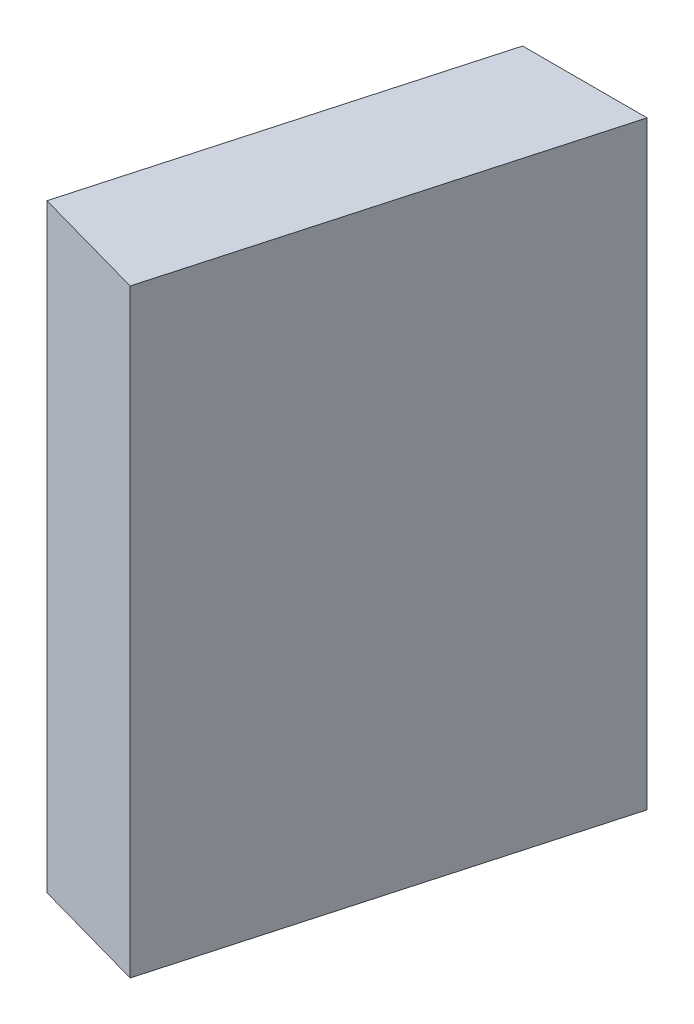
ISO-10303-21;
HEADER;
FILE_DESCRIPTION(('STEP AP214'),'2;1');
FILE_NAME('part.step','',(''),(''),'','','');
FILE_SCHEMA(('AUTOMOTIVE_DESIGN { 1 0 10303 214 1 1 1 1 }'));
ENDSEC;
DATA;
#1=APPLICATION_CONTEXT('core data for automotive mechanical design processes');
#2=APPLICATION_PROTOCOL_DEFINITION('international standard','automotive_design',2000,#1);
#3=PRODUCT_CONTEXT('',#1,'mechanical');
#4=PRODUCT('Part','Part','',(#3));
#5=PRODUCT_RELATED_PRODUCT_CATEGORY('part','',(#4));
#6=PRODUCT_DEFINITION_FORMATION('','',#4);
#7=PRODUCT_DEFINITION_CONTEXT('part definition',#1,'design');
#8=PRODUCT_DEFINITION('design','',#6,#7);
#9=PRODUCT_DEFINITION_SHAPE('','',#8);
#10=(LENGTH_UNIT() NAMED_UNIT(*) SI_UNIT(.MILLI.,.METRE.));
#11=(NAMED_UNIT(*) PLANE_ANGLE_UNIT() SI_UNIT($,.RADIAN.));
#12=(NAMED_UNIT(*) SI_UNIT($,.STERADIAN.) SOLID_ANGLE_UNIT());
#13=UNCERTAINTY_MEASURE_WITH_UNIT(LENGTH_MEASURE(1.E-05),#10,'distance_accuracy_value','');
#14=(GEOMETRIC_REPRESENTATION_CONTEXT(3) GLOBAL_UNCERTAINTY_ASSIGNED_CONTEXT((#13)) GLOBAL_UNIT_ASSIGNED_CONTEXT((#10,
#11,#12)) REPRESENTATION_CONTEXT('',''));
#15=CARTESIAN_POINT('',(0.,0.,0.));
#16=DIRECTION('',(0.,0.,1.));
#17=DIRECTION('',(1.,0.,0.));
#18=AXIS2_PLACEMENT_3D('',#15,#16,#17);
#19=CARTESIAN_POINT('',(-0.380918001429,2.27,0.620404284469));
#20=DIRECTION('',(0.963144527196361,0.,0.268984422842101));
#21=DIRECTION('',(0.268984422842101,0.,-0.963144527196361));
#22=AXIS2_PLACEMENT_3D('',#19,#20,#21);
#23=PLANE('',#22);
#24=DIRECTION('',(0.,1.,0.));
#25=VECTOR('',#24,1.);
#26=CARTESIAN_POINT('',(-0.380918001428911,2.27,0.620404284468681));
#27=LINE('',#26,#25);
#28=CARTESIAN_POINT('',(-0.380918001428956,1.27,0.62040428446884));
#29=VERTEX_POINT('',#28);
#30=CARTESIAN_POINT('',(-0.380918001428956,2.27,0.62040428446884));
#31=VERTEX_POINT('',#30);
#32=EDGE_CURVE('E19',#29,#31,#27,.T.);
#33=ORIENTED_EDGE('',*,*,#32,.T.);
#34=DIRECTION('',(0.268984422841911,0.,-0.963144527196414));
#35=VECTOR('',#34,1.);
#36=CARTESIAN_POINT('',(-0.380918001429,2.27,0.620404284469));
#37=LINE('',#36,#35);
#38=CARTESIAN_POINT('',(-0.207653155214969,2.27,0.));
#39=VERTEX_POINT('',#38);
#40=EDGE_CURVE('E54',#31,#39,#37,.T.);
#41=ORIENTED_EDGE('',*,*,#40,.T.);
#42=DIRECTION('',(0.,1.,0.));
#43=VECTOR('',#42,1.);
#44=CARTESIAN_POINT('',(-0.207653155215,2.27,0.));
#45=LINE('',#44,#43);
#46=CARTESIAN_POINT('',(-0.207653155214969,1.27,0.));
#47=VERTEX_POINT('',#46);
#48=EDGE_CURVE('E75',#39,#47,#45,.F.);
#49=ORIENTED_EDGE('',*,*,#48,.T.);
#50=DIRECTION('',(0.268984422841911,0.,-0.963144527196414));
#51=VECTOR('',#50,1.);
#52=CARTESIAN_POINT('',(-0.380918001429,1.27,0.620404284469));
#53=LINE('',#52,#51);
#54=EDGE_CURVE('E57',#29,#47,#53,.T.);
#55=ORIENTED_EDGE('',*,*,#54,.F.);
#56=EDGE_LOOP('',(#33,#41,#49,#55));
#57=FACE_BOUND('',#56,.T.);
#58=ADVANCED_FACE('F16',(#57),#23,.F.);
#59=CARTESIAN_POINT('',(-0.18828909599,2.27,0.674201169037));
#60=DIRECTION('',(0.268984422842101,0.,-0.963144527196361));
#61=DIRECTION('',(-0.963144527196361,0.,-0.268984422842101));
#62=AXIS2_PLACEMENT_3D('',#59,#60,#61);
#63=PLANE('',#62);
#64=DIRECTION('',(0.,1.,0.));
#65=VECTOR('',#64,1.);
#66=CARTESIAN_POINT('',(-0.188289095989392,2.27,0.67420116903717));
#67=LINE('',#66,#65);
#68=CARTESIAN_POINT('',(-0.188289095989848,1.27,0.674201169037043));
#69=VERTEX_POINT('',#68);
#70=CARTESIAN_POINT('',(-0.188289095989848,2.27,0.674201169037043));
#71=VERTEX_POINT('',#70);
#72=EDGE_CURVE('E72',#69,#71,#67,.T.);
#73=ORIENTED_EDGE('',*,*,#72,.T.);
#74=DIRECTION('',(-0.963144527196807,0.,-0.268984422840505));
#75=VECTOR('',#74,1.);
#76=CARTESIAN_POINT('',(-0.18828909599,2.27,0.674201169037));
#77=LINE('',#76,#75);
#78=EDGE_CURVE('E62',#71,#31,#77,.T.);
#79=ORIENTED_EDGE('',*,*,#78,.T.);
#80=ORIENTED_EDGE('',*,*,#32,.F.);
#81=DIRECTION('',(-0.963144527196807,0.,-0.268984422840505));
#82=VECTOR('',#81,1.);
#83=CARTESIAN_POINT('',(-0.18828909599,1.27,0.674201169037));
#84=LINE('',#83,#82);
#85=EDGE_CURVE('E78',#69,#29,#84,.T.);
#86=ORIENTED_EDGE('',*,*,#85,.F.);
#87=EDGE_LOOP('',(#73,#79,#80,#86));
#88=FACE_BOUND('',#87,.T.);
#89=ADVANCED_FACE('F71',(#88),#63,.F.);
#90=CARTESIAN_POINT('',(0.,2.27,0.));
#91=DIRECTION('',(0.,-1.,0.));
#92=DIRECTION('',(0.,0.,-1.));
#93=AXIS2_PLACEMENT_3D('',#90,#91,#92);
#94=PLANE('',#93);
#95=ORIENTED_EDGE('',*,*,#40,.F.);
#96=ORIENTED_EDGE('',*,*,#78,.F.);
#97=DIRECTION('',(-0.268984422842101,0.,0.963144527196361));
#98=VECTOR('',#97,1.);
#99=CARTESIAN_POINT('',(0.,2.27,0.));
#100=LINE('',#99,#98);
#101=CARTESIAN_POINT('',(0.,2.27,0.));
#102=VERTEX_POINT('',#101);
#103=EDGE_CURVE('E82',#71,#102,#100,.F.);
#104=ORIENTED_EDGE('',*,*,#103,.T.);
#105=DIRECTION('',(1.,0.,0.));
#106=VECTOR('',#105,1.);
#107=CARTESIAN_POINT('',(-0.207653155215,2.27,0.));
#108=LINE('',#107,#106);
#109=EDGE_CURVE('E68',#102,#39,#108,.F.);
#110=ORIENTED_EDGE('',*,*,#109,.T.);
#111=EDGE_LOOP('',(#95,#96,#104,#110));
#112=FACE_BOUND('',#111,.T.);
#113=ADVANCED_FACE('F65',(#112),#94,.F.);
#114=CARTESIAN_POINT('',(-0.207653155215,2.27,0.));
#115=DIRECTION('',(0.,0.,1.));
#116=DIRECTION('',(1.,0.,0.));
#117=AXIS2_PLACEMENT_3D('',#114,#115,#116);
#118=PLANE('',#117);
#119=ORIENTED_EDGE('',*,*,#48,.F.);
#120=ORIENTED_EDGE('',*,*,#109,.F.);
#121=DIRECTION('',(0.,1.,0.));
#122=VECTOR('',#121,1.);
#123=CARTESIAN_POINT('',(0.,2.27,0.));
#124=LINE('',#123,#122);
#125=CARTESIAN_POINT('',(0.,1.27,0.));
#126=VERTEX_POINT('',#125);
#127=EDGE_CURVE('E25',#102,#126,#124,.F.);
#128=ORIENTED_EDGE('',*,*,#127,.T.);
#129=DIRECTION('',(1.,0.,0.));
#130=VECTOR('',#129,1.);
#131=CARTESIAN_POINT('',(0.,1.27,0.));
#132=LINE('',#131,#130);
#133=EDGE_CURVE('E33',#47,#126,#132,.T.);
#134=ORIENTED_EDGE('',*,*,#133,.F.);
#135=EDGE_LOOP('',(#119,#120,#128,#134));
#136=FACE_BOUND('',#135,.T.);
#137=ADVANCED_FACE('F87',(#136),#118,.F.);
#138=CARTESIAN_POINT('',(0.,1.27,0.));
#139=DIRECTION('',(0.,-1.,0.));
#140=DIRECTION('',(0.,0.,-1.));
#141=AXIS2_PLACEMENT_3D('',#138,#139,#140);
#142=PLANE('',#141);
#143=ORIENTED_EDGE('',*,*,#85,.T.);
#144=ORIENTED_EDGE('',*,*,#54,.T.);
#145=ORIENTED_EDGE('',*,*,#133,.T.);
#146=DIRECTION('',(-0.268984422842101,0.,0.963144527196361));
#147=VECTOR('',#146,1.);
#148=CARTESIAN_POINT('',(0.,1.27,0.));
#149=LINE('',#148,#147);
#150=EDGE_CURVE('E11',#126,#69,#149,.T.);
#151=ORIENTED_EDGE('',*,*,#150,.T.);
#152=EDGE_LOOP('',(#143,#144,#145,#151));
#153=FACE_BOUND('',#152,.T.);
#154=ADVANCED_FACE('F90',(#153),#142,.T.);
#155=CARTESIAN_POINT('',(0.,2.27,0.));
#156=DIRECTION('',(-0.963144527196361,0.,-0.268984422842101));
#157=DIRECTION('',(-0.268984422842101,0.,0.963144527196361));
#158=AXIS2_PLACEMENT_3D('',#155,#156,#157);
#159=PLANE('',#158);
#160=ORIENTED_EDGE('',*,*,#127,.F.);
#161=ORIENTED_EDGE('',*,*,#103,.F.);
#162=ORIENTED_EDGE('',*,*,#72,.F.);
#163=ORIENTED_EDGE('',*,*,#150,.F.);
#164=EDGE_LOOP('',(#160,#161,#162,#163));
#165=FACE_BOUND('',#164,.T.);
#166=ADVANCED_FACE('F89',(#165),#159,.F.);
#167=CLOSED_SHELL('',(#58,#89,#113,#137,#154,#166));
#168=MANIFOLD_SOLID_BREP('B1',#167);
#169=ADVANCED_BREP_SHAPE_REPRESENTATION('',(#18,#168),#14);
#170=SHAPE_DEFINITION_REPRESENTATION(#9,#169);
ENDSEC;
END-ISO-10303-21;
